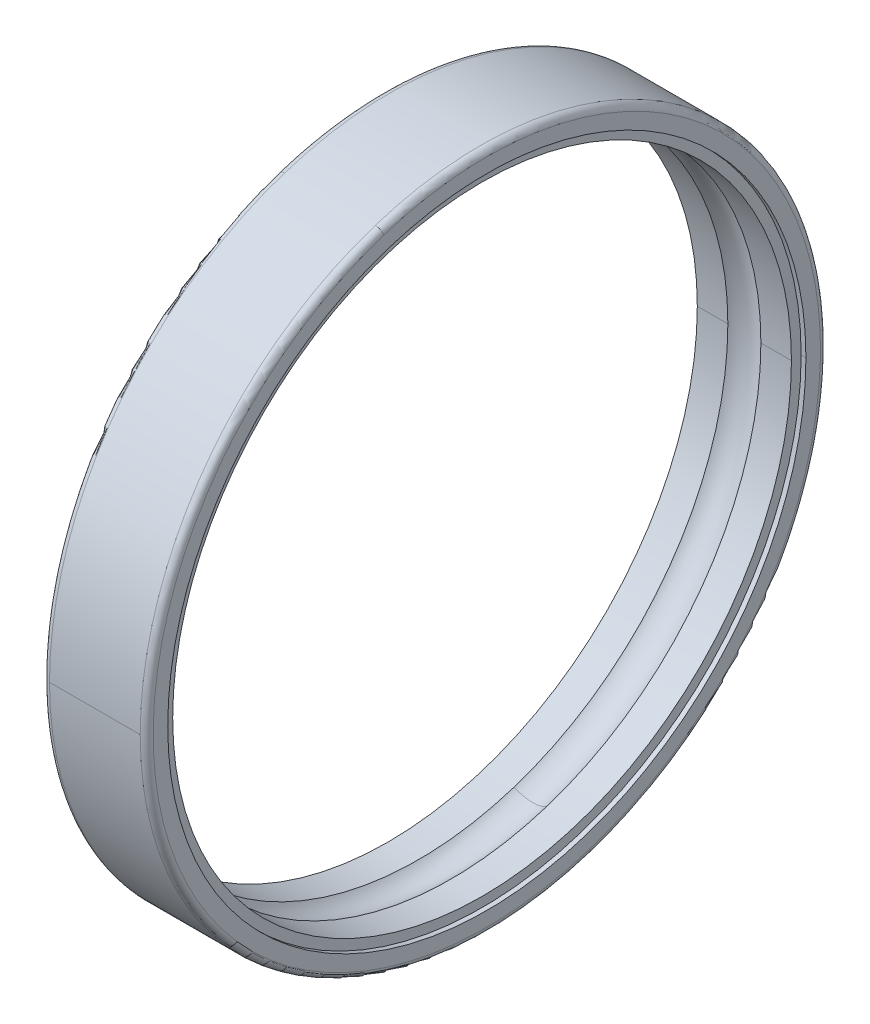
ISO-10303-21;
HEADER;
FILE_DESCRIPTION(('STEP AP214'),'2;1');
FILE_NAME('part.step','',(''),(''),'','','');
FILE_SCHEMA(('AUTOMOTIVE_DESIGN { 1 0 10303 214 1 1 1 1 }'));
ENDSEC;
DATA;
#1=APPLICATION_CONTEXT('core data for automotive mechanical design processes');
#2=APPLICATION_PROTOCOL_DEFINITION('international standard','automotive_design',2000,#1);
#3=PRODUCT_CONTEXT('',#1,'mechanical');
#4=PRODUCT('Part','Part','',(#3));
#5=PRODUCT_RELATED_PRODUCT_CATEGORY('part','',(#4));
#6=PRODUCT_DEFINITION_FORMATION('','',#4);
#7=PRODUCT_DEFINITION_CONTEXT('part definition',#1,'design');
#8=PRODUCT_DEFINITION('design','',#6,#7);
#9=PRODUCT_DEFINITION_SHAPE('','',#8);
#10=(LENGTH_UNIT() NAMED_UNIT(*) SI_UNIT(.MILLI.,.METRE.));
#11=(NAMED_UNIT(*) PLANE_ANGLE_UNIT() SI_UNIT($,.RADIAN.));
#12=(NAMED_UNIT(*) SI_UNIT($,.STERADIAN.) SOLID_ANGLE_UNIT());
#13=UNCERTAINTY_MEASURE_WITH_UNIT(LENGTH_MEASURE(1.E-05),#10,'distance_accuracy_value','');
#14=(GEOMETRIC_REPRESENTATION_CONTEXT(3) GLOBAL_UNCERTAINTY_ASSIGNED_CONTEXT((#13)) GLOBAL_UNIT_ASSIGNED_CONTEXT((#10,
#11,#12)) REPRESENTATION_CONTEXT('',''));
#15=CARTESIAN_POINT('',(0.,0.,0.));
#16=DIRECTION('',(0.,0.,1.));
#17=DIRECTION('',(1.,0.,0.));
#18=AXIS2_PLACEMENT_3D('',#15,#16,#17);
#19=CARTESIAN_POINT('',(0.,51.5,0.));
#20=DIRECTION('',(-1.,0.,0.));
#21=DIRECTION('',(0.,0.,1.));
#22=AXIS2_PLACEMENT_3D('',#19,#20,#21);
#23=PLANE('',#22);
#24=CARTESIAN_POINT('',(0.,0.,0.));
#25=DIRECTION('',(1.,0.,0.));
#26=DIRECTION('',(0.,0.,-1.));
#27=AXIS2_PLACEMENT_3D('',#24,#25,#26);
#28=CIRCLE('',#27,49.25);
#29=CARTESIAN_POINT('',(0.,0.,-49.25));
#30=VERTEX_POINT('',#29);
#31=CARTESIAN_POINT('',(0.,0.,49.25));
#32=VERTEX_POINT('',#31);
#33=EDGE_CURVE('E11',#30,#32,#28,.T.);
#34=ORIENTED_EDGE('',*,*,#33,.T.);
#35=CARTESIAN_POINT('',(0.,0.,0.));
#36=DIRECTION('',(1.,0.,0.));
#37=DIRECTION('',(0.,0.,-1.));
#38=AXIS2_PLACEMENT_3D('',#35,#36,#37);
#39=CIRCLE('',#38,49.25);
#40=EDGE_CURVE('E28',#32,#30,#39,.T.);
#41=ORIENTED_EDGE('',*,*,#40,.T.);
#42=EDGE_LOOP('',(#34,#41));
#43=FACE_BOUND('',#42,.T.);
#44=CARTESIAN_POINT('',(0.,48.9794105892011,15.9143752103102));
#45=CARTESIAN_POINT('',(0.,48.7190289709904,16.7158052750082));
#46=CARTESIAN_POINT('',(0.,48.4389445298725,17.5108319052051));
#47=CARTESIAN_POINT('',(0.,47.840118198443,19.0861909266786));
#48=CARTESIAN_POINT('',(0.,47.5213763081314,19.8665233179551));
#49=CARTESIAN_POINT('',(0.,46.845983274935,21.4106064916693));
#50=CARTESIAN_POINT('',(0.,46.4893321320502,22.1743572741071));
#51=CARTESIAN_POINT('',(0.,45.7389850709269,23.6834392920971));
#52=CARTESIAN_POINT('',(0.,45.3452891526884,24.4287705276492));
#53=CARTESIAN_POINT('',(0.,44.521799575811,25.8992173465381));
#54=CARTESIAN_POINT('',(0.,44.0920059171723,26.6243329298749));
#55=CARTESIAN_POINT('',(0.,43.1973566486751,28.0526017212956));
#56=CARTESIAN_POINT('',(0.,42.7325010388167,28.7557549293796));
#57=CARTESIAN_POINT('',(0.,41.7688476443124,30.1384049740656));
#58=CARTESIAN_POINT('',(0.,41.2700498596664,30.8179018106675));
#59=CARTESIAN_POINT('',(0.,40.2397137903227,32.1516021553258));
#60=CARTESIAN_POINT('',(0.,39.708175505625,32.8058056633821));
#61=CARTESIAN_POINT('',(0.,38.6136389511792,34.0873433146281));
#62=CARTESIAN_POINT('',(0.,38.0506406814312,34.7146774578178));
#63=CARTESIAN_POINT('',(0.,36.894540470981,35.9409650771734));
#64=CARTESIAN_POINT('',(0.,36.3014385302789,36.5399185533394));
#65=CARTESIAN_POINT('',(0.,35.0865598119225,37.7080019070626));
#66=CARTESIAN_POINT('',(0.,34.4647830342682,38.2771317846199));
#67=CARTESIAN_POINT('',(0.,33.194052556866,39.3841968574541));
#68=CARTESIAN_POINT('',(0.,32.5450988571181,39.922132052731));
#69=CARTESIAN_POINT('',(0.,31.2215779217956,40.9655118279872));
#70=CARTESIAN_POINT('',(0.,30.547010686221,41.4709564079665));
#71=CARTESIAN_POINT('',(0.,29.1738877708107,42.4481372923664));
#72=CARTESIAN_POINT('',(0.,28.475332090975,42.919873596787));
#73=CARTESIAN_POINT('',(0.,27.0559151688587,43.828501475992));
#74=CARTESIAN_POINT('',(0.,26.3350539265782,44.2653930507763));
#75=CARTESIAN_POINT('',(0.,24.8727624974458,45.1032789606382));
#76=CARTESIAN_POINT('',(0.,24.1313323105938,45.5042732957157));
#77=CARTESIAN_POINT('',(0.,22.62968916258,46.2693986956877));
#78=CARTESIAN_POINT('',(0.,21.8694762014182,46.6335297605821));
#79=CARTESIAN_POINT('',(0.,20.3320989243949,47.3240513965586));
#80=CARTESIAN_POINT('',(0.,19.5549346085334,47.6504419676405));
#81=CARTESIAN_POINT('',(0.,17.9855268790194,48.2646963125178));
#82=CARTESIAN_POINT('',(0.,17.1932834653668,48.5525600863131));
#83=CARTESIAN_POINT('',(0.,15.5956261240462,49.0890673475721));
#84=CARTESIAN_POINT('',(0.,14.7902121963782,49.3377108350357));
#85=CARTESIAN_POINT('',(0.,13.1681541397247,49.7951785196915));
#86=CARTESIAN_POINT('',(0.,12.3515100107391,50.0040027168837));
#87=CARTESIAN_POINT('',(0.,10.7089589186865,50.3813287452146));
#88=CARTESIAN_POINT('',(0.,9.88305195561949,50.5498305763533));
#89=CARTESIAN_POINT('',(0.,8.22396487761912,50.8461059369072));
#90=CARTESIAN_POINT('',(0.,7.39078476268573,50.9738794663223));
#91=CARTESIAN_POINT('',(0.,5.71915858482735,51.1883904058048));
#92=CARTESIAN_POINT('',(0.,4.88071252190237,51.2751278158723));
#93=CARTESIAN_POINT('',(0.,3.20057433806561,51.4073575586415));
#94=CARTESIAN_POINT('',(0.,2.35888221715382,51.4528498913432));
#95=CARTESIAN_POINT('',(0.,0.674279627386248,51.5024798843666));
#96=CARTESIAN_POINT('',(0.,-0.168630841469536,51.5066175446884));
#97=CARTESIAN_POINT('',(0.,-1.85363948197539,51.4735282249659));
#98=CARTESIAN_POINT('',(0.,-2.69573765362546,51.4363012449216));
#99=CARTESIAN_POINT('',(0.,-4.37709301146531,51.3205723275226));
#100=CARTESIAN_POINT('',(0.,-5.21635019765509,51.2420703901679));
#101=CARTESIAN_POINT('',(0.,-6.89000174050256,51.0439806761911));
#102=CARTESIAN_POINT('',(0.,-7.72439609716024,50.924392899569));
#103=CARTESIAN_POINT('',(0.,-9.38631185185404,50.644419604486));
#104=CARTESIAN_POINT('',(0.,-10.2138332498902,50.484034086025));
#105=CARTESIAN_POINT('',(0.,-11.8600095158106,50.1228516900264));
#106=CARTESIAN_POINT('',(0.,-12.6786643836949,49.9220548124887));
#107=CARTESIAN_POINT('',(0.,-14.3051353780294,49.4805334356022));
#108=CARTESIAN_POINT('',(0.,-15.1129515044796,49.2398089362535));
#109=CARTESIAN_POINT('',(0.,-16.7157989161407,48.7190122421488));
#110=CARTESIAN_POINT('',(0.,-17.5108302013517,48.4389400473929));
#111=CARTESIAN_POINT('',(0.,-19.0861926305319,47.8401226809226));
#112=CARTESIAN_POINT('',(0.,-19.8665237745012,47.5213775092082));
#113=CARTESIAN_POINT('',(0.,-21.4106060351231,46.8459820738582));
#114=CARTESIAN_POINT('',(0.,-22.1743571517759,46.4893318102227));
#115=CARTESIAN_POINT('',(0.,-23.6834394144282,45.7389853927545));
#116=CARTESIAN_POINT('',(0.,-24.4287705604277,45.3452892389218));
#117=CARTESIAN_POINT('',(0.,-25.8992173137596,44.5217994895776));
#118=CARTESIAN_POINT('',(0.,-26.6243329210919,44.0920058940661));
#119=CARTESIAN_POINT('',(0.,-28.0526017300786,43.1973566717813));
#120=CARTESIAN_POINT('',(0.,-28.755754931733,42.732501045008));
#121=CARTESIAN_POINT('',(0.,-30.1384049717121,41.7688476381211));
#122=CARTESIAN_POINT('',(0.,-30.8179018100369,41.2700498580075));
#123=CARTESIAN_POINT('',(0.,-32.1516021559563,40.2397137919817));
#124=CARTESIAN_POINT('',(0.,-32.805805663551,39.7081755060696));
#125=CARTESIAN_POINT('',(0.,-34.0873433144591,38.6136389507348));
#126=CARTESIAN_POINT('',(0.,-34.7146774577724,38.0506406813121));
#127=CARTESIAN_POINT('',(0.,-35.9409650772186,36.8945404711002));
#128=CARTESIAN_POINT('',(0.,-36.5399185533515,36.3014385303109));
#129=CARTESIAN_POINT('',(0.,-37.7080019070504,35.0865598118906));
#130=CARTESIAN_POINT('',(0.,-38.2771317846166,34.4647830342596));
#131=CARTESIAN_POINT('',(0.,-39.3841968574573,33.1940525568745));
#132=CARTESIAN_POINT('',(0.,-39.9221320527318,32.5450988571204));
#133=CARTESIAN_POINT('',(0.,-40.9655118279863,31.2215779217934));
#134=CARTESIAN_POINT('',(0.,-41.4709564079662,30.5470106862204));
#135=CARTESIAN_POINT('',(0.,-42.4481372923666,29.1738877708113));
#136=CARTESIAN_POINT('',(0.,-42.919873596787,28.4753320909752));
#137=CARTESIAN_POINT('',(0.,-43.8285014759919,27.0559151688586));
#138=CARTESIAN_POINT('',(0.,-44.2653930507763,26.3350539265782));
#139=CARTESIAN_POINT('',(0.,-45.1032789606382,24.8727624974459));
#140=CARTESIAN_POINT('',(0.,-45.5042732957157,24.1313323105939));
#141=CARTESIAN_POINT('',(0.,-46.2693986956877,22.6296891625801));
#142=CARTESIAN_POINT('',(0.,-46.6335297605821,21.8694762014182));
#143=CARTESIAN_POINT('',(0.,-47.3240513965586,20.3320989243949));
#144=CARTESIAN_POINT('',(0.,-47.6504419676407,19.5549346085334));
#145=CARTESIAN_POINT('',(0.,-48.2646963125176,17.9855268790195));
#146=CARTESIAN_POINT('',(0.,-48.5525600863125,17.193283465367));
#147=CARTESIAN_POINT('',(0.,-49.0890673475727,15.5956261240461));
#148=CARTESIAN_POINT('',(0.,-49.3377108350381,14.7902121963776));
#149=CARTESIAN_POINT('',(0.,-49.7951785196892,13.1681541397254));
#150=CARTESIAN_POINT('',(0.,-50.0040027168748,12.3515100107415));
#151=CARTESIAN_POINT('',(0.,-50.3813287452234,10.7089589186841));
#152=CARTESIAN_POINT('',(0.,-50.5498305763862,9.88305195561061));
#153=CARTESIAN_POINT('',(0.,-50.8461059368742,8.22396487762812));
#154=CARTESIAN_POINT('',(0.,-50.9738794661993,7.39078476271915));
#155=CARTESIAN_POINT('',(0.,-51.1883904059278,5.719158584794));
#156=CARTESIAN_POINT('',(0.,-51.2751278163312,4.88071252177782));
#157=CARTESIAN_POINT('',(0.,-51.4073575581825,3.20057433819022));
#158=CARTESIAN_POINT('',(0.,-51.4528498896304,2.35888221761881));
#159=CARTESIAN_POINT('',(0.,-51.5024798860794,0.674279626921349));
#160=CARTESIAN_POINT('',(0.,-51.5066175510805,-0.168630843204695));
#161=CARTESIAN_POINT('',(0.,-51.4735282185737,-1.85363948024013));
#162=CARTESIAN_POINT('',(0.,-51.4363012210658,-2.69573764714952));
#163=CARTESIAN_POINT('',(0.,-51.3205723513784,-4.37709301794116));
#164=CARTESIAN_POINT('',(0.,-51.242070479199,-5.2163502218234));
#165=CARTESIAN_POINT('',(0.,-51.04398058716,-6.89000171633418));
#166=CARTESIAN_POINT('',(0.,-50.9243925673006,-7.72439600696272));
#167=CARTESIAN_POINT('',(0.,-50.6444199367544,-9.38631194205151));
#168=CARTESIAN_POINT('',(0.,-50.4840353260676,-10.2138335865118));
#169=CARTESIAN_POINT('',(0.,-50.1228504499838,-11.8600091791889));
#170=CARTESIAN_POINT('',(0.,-49.9220501845866,-12.6786631274058));
#171=CARTESIAN_POINT('',(0.,-49.4805380635043,-14.3051366343184));
#172=CARTESIAN_POINT('',(0.,-49.2398262078191,-15.1129561930141));
#173=CARTESIAN_POINT('',(0.,-48.9794105892012,-15.9143752103101));
#174=B_SPLINE_CURVE_WITH_KNOTS('',3,(#44,#45,#46,#47,#48,#49,#50,#51,#52,#53,#54,#55,#56,#57,
#58,#59,#60,#61,#62,#63,#64,#65,#66,#67,#68,#69,#70,#71,#72,#73,#74,#75,#76,#77,#78,#79,#80,#81,
#82,#83,#84,#85,#86,#87,#88,#89,#90,#91,#92,#93,#94,#95,#96,#97,#98,#99,#100,#101,#102,#103,
#104,#105,#106,#107,#108,#109,#110,#111,#112,#113,#114,#115,#116,#117,#118,#119,#120,#121,#122,
#123,#124,#125,#126,#127,#128,#129,#130,#131,#132,#133,#134,#135,#136,#137,#138,#139,#140,#141,
#142,#143,#144,#145,#146,#147,#148,#149,#150,#151,#152,#153,#154,#155,#156,#157,#158,#159,#160,
#161,#162,#163,#164,#165,#166,#167,#168,#169,#170,#171,#172,#173),.UNSPECIFIED.,.F.,.F.,(4,2,2,
2,2,2,2,2,2,2,2,2,2,2,2,2,2,2,2,2,2,2,2,2,2,2,2,2,2,2,2,2,2,2,2,2,2,2,2,2,2,2,2,2,2,2,2,2,2,2,2,
2,2,2,2,2,2,2,2,2,2,2,2,2,4),(0.,2.52774653785999,5.05549307572001,7.58323961358001,
10.11098615144,12.6387326893,15.16647922716,17.69422576502,20.22197230288,22.74971884074,
25.2774653786,27.8052119164601,30.33295845432,32.8607049921801,35.3884515300401,
37.9161980679001,40.4439446057601,42.9716911436201,45.4994376814801,48.0271842193401,
50.5549307572001,53.0826772950601,55.6104238329201,58.1381703707801,60.6659169086401,
63.1936634465001,65.7214099843601,68.2491565222201,70.7769030600801,73.3046495979401,
75.8323961358001,78.3601426736601,80.8878892115201,83.4156357493802,85.9433822872401,
88.4711288251002,90.9988753629601,93.5266219008202,96.0543684386801,98.5821149765401,
101.1098615144,103.63760805226,106.16535459012,108.69310112798,111.22084766584,113.7485942037,
116.27634074156,118.80408727942,121.33183381728,123.85958035514,126.387326893,128.91507343086,
131.44281996872,133.97056650658,136.49831304444,139.0260595823,141.55380612016,144.08155265802,
146.60929919588,149.13704573374,151.6647922716,154.19253880946,156.72028534732,159.24803188518,
161.77577842304),.UNSPECIFIED.);
#175=CARTESIAN_POINT('',(0.,48.9794105892012,15.91437521031));
#176=VERTEX_POINT('',#175);
#177=CARTESIAN_POINT('',(0.,-48.9794105892012,-15.91437521031));
#178=VERTEX_POINT('',#177);
#179=EDGE_CURVE('E320',#176,#178,#174,.T.);
#180=ORIENTED_EDGE('',*,*,#179,.F.);
#181=CARTESIAN_POINT('',(0.,-48.9794105892011,-15.9143752103102));
#182=CARTESIAN_POINT('',(0.,-48.7190289709904,-16.7158052750082));
#183=CARTESIAN_POINT('',(0.,-48.4389445298725,-17.5108319052051));
#184=CARTESIAN_POINT('',(0.,-47.840118198443,-19.0861909266786));
#185=CARTESIAN_POINT('',(0.,-47.5213763081314,-19.8665233179551));
#186=CARTESIAN_POINT('',(0.,-46.845983274935,-21.4106064916693));
#187=CARTESIAN_POINT('',(0.,-46.4893321320502,-22.1743572741071));
#188=CARTESIAN_POINT('',(0.,-45.7389850709269,-23.683439292097));
#189=CARTESIAN_POINT('',(0.,-45.3452891526884,-24.4287705276492));
#190=CARTESIAN_POINT('',(0.,-44.521799575811,-25.8992173465381));
#191=CARTESIAN_POINT('',(0.,-44.0920059171723,-26.6243329298749));
#192=CARTESIAN_POINT('',(0.,-43.1973566486751,-28.0526017212956));
#193=CARTESIAN_POINT('',(0.,-42.7325010388167,-28.7557549293796));
#194=CARTESIAN_POINT('',(0.,-41.7688476443124,-30.1384049740655));
#195=CARTESIAN_POINT('',(0.,-41.2700498596664,-30.8179018106675));
#196=CARTESIAN_POINT('',(0.,-40.2397137903227,-32.1516021553257));
#197=CARTESIAN_POINT('',(0.,-39.708175505625,-32.8058056633821));
#198=CARTESIAN_POINT('',(0.,-38.6136389511793,-34.0873433146281));
#199=CARTESIAN_POINT('',(0.,-38.0506406814312,-34.7146774578177));
#200=CARTESIAN_POINT('',(0.,-36.894540470981,-35.9409650771734));
#201=CARTESIAN_POINT('',(0.,-36.301438530279,-36.5399185533393));
#202=CARTESIAN_POINT('',(0.,-35.0865598119225,-37.7080019070626));
#203=CARTESIAN_POINT('',(0.,-34.4647830342682,-38.2771317846198));
#204=CARTESIAN_POINT('',(0.,-33.194052556866,-39.384196857454));
#205=CARTESIAN_POINT('',(0.,-32.5450988571181,-39.9221320527309));
#206=CARTESIAN_POINT('',(0.,-31.2215779217956,-40.9655118279871));
#207=CARTESIAN_POINT('',(0.,-30.547010686221,-41.4709564079664));
#208=CARTESIAN_POINT('',(0.,-29.1738877708107,-42.4481372923664));
#209=CARTESIAN_POINT('',(0.,-28.475332090975,-42.919873596787));
#210=CARTESIAN_POINT('',(0.,-27.0559151688588,-43.828501475992));
#211=CARTESIAN_POINT('',(0.,-26.3350539265783,-44.2653930507763));
#212=CARTESIAN_POINT('',(0.,-24.8727624974458,-45.1032789606382));
#213=CARTESIAN_POINT('',(0.,-24.1313323105939,-45.5042732957157));
#214=CARTESIAN_POINT('',(0.,-22.6296891625801,-46.2693986956877));
#215=CARTESIAN_POINT('',(0.,-21.8694762014182,-46.6335297605821));
#216=CARTESIAN_POINT('',(0.,-20.3320989243949,-47.3240513965586));
#217=CARTESIAN_POINT('',(0.,-19.5549346085335,-47.6504419676405));
#218=CARTESIAN_POINT('',(0.,-17.9855268790194,-48.2646963125178));
#219=CARTESIAN_POINT('',(0.,-17.1932834653668,-48.5525600863131));
#220=CARTESIAN_POINT('',(0.,-15.5956261240462,-49.089067347572));
#221=CARTESIAN_POINT('',(0.,-14.7902121963783,-49.3377108350357));
#222=CARTESIAN_POINT('',(0.,-13.1681541397247,-49.7951785196915));
#223=CARTESIAN_POINT('',(0.,-12.3515100107391,-50.0040027168837));
#224=CARTESIAN_POINT('',(0.,-10.7089589186865,-50.3813287452145));
#225=CARTESIAN_POINT('',(0.,-9.88305195561955,-50.5498305763533));
#226=CARTESIAN_POINT('',(0.,-8.22396487761919,-50.8461059369071));
#227=CARTESIAN_POINT('',(0.,-7.3907847626858,-50.9738794663222));
#228=CARTESIAN_POINT('',(0.,-5.71915858482743,-51.1883904058048));
#229=CARTESIAN_POINT('',(0.,-4.88071252190245,-51.2751278158723));
#230=CARTESIAN_POINT('',(0.,-3.20057433806567,-51.4073575586415));
#231=CARTESIAN_POINT('',(0.,-2.35888221715388,-51.4528498913432));
#232=CARTESIAN_POINT('',(0.,-0.674279627386307,-51.5024798843666));
#233=CARTESIAN_POINT('',(0.,0.168630841469469,-51.5066175446884));
#234=CARTESIAN_POINT('',(0.,1.85363948197532,-51.4735282249659));
#235=CARTESIAN_POINT('',(0.,2.69573765362539,-51.4363012449216));
#236=CARTESIAN_POINT('',(0.,4.37709301146523,-51.3205723275226));
#237=CARTESIAN_POINT('',(0.,5.216350197655,-51.2420703901679));
#238=CARTESIAN_POINT('',(0.,6.89000174050246,-51.0439806761911));
#239=CARTESIAN_POINT('',(0.,7.72439609716015,-50.924392899569));
#240=CARTESIAN_POINT('',(0.,9.38631185185395,-50.644419604486));
#241=CARTESIAN_POINT('',(0.,10.2138332498901,-50.484034086025));
#242=CARTESIAN_POINT('',(0.,11.8600095158105,-50.1228516900264));
#243=CARTESIAN_POINT('',(0.,12.6786643836948,-49.9220548124887));
#244=CARTESIAN_POINT('',(0.,14.3051353780293,-49.4805334356022));
#245=CARTESIAN_POINT('',(0.,15.1129515044795,-49.2398089362535));
#246=CARTESIAN_POINT('',(0.,16.7157989161406,-48.7190122421489));
#247=CARTESIAN_POINT('',(0.,17.5108302013516,-48.438940047393));
#248=CARTESIAN_POINT('',(0.,19.0861926305318,-47.8401226809227));
#249=CARTESIAN_POINT('',(0.,19.8665237745011,-47.5213775092082));
#250=CARTESIAN_POINT('',(0.,21.4106060351231,-46.8459820738583));
#251=CARTESIAN_POINT('',(0.,22.1743571517758,-46.4893318102227));
#252=CARTESIAN_POINT('',(0.,23.6834394144281,-45.7389853927545));
#253=CARTESIAN_POINT('',(0.,24.4287705604276,-45.3452892389219));
#254=CARTESIAN_POINT('',(0.,25.8992173137595,-44.5217994895777));
#255=CARTESIAN_POINT('',(0.,26.6243329210918,-44.0920058940662));
#256=CARTESIAN_POINT('',(0.,28.0526017300785,-43.1973566717814));
#257=CARTESIAN_POINT('',(0.,28.7557549317329,-42.7325010450081));
#258=CARTESIAN_POINT('',(0.,30.138404971712,-41.7688476381212));
#259=CARTESIAN_POINT('',(0.,30.8179018100368,-41.2700498580076));
#260=CARTESIAN_POINT('',(0.,32.1516021559562,-40.2397137919818));
#261=CARTESIAN_POINT('',(0.,32.8058056635509,-39.7081755060696));
#262=CARTESIAN_POINT('',(0.,34.087343314459,-38.6136389507348));
#263=CARTESIAN_POINT('',(0.,34.7146774577723,-38.0506406813122));
#264=CARTESIAN_POINT('',(0.,35.9409650772185,-36.8945404711003));
#265=CARTESIAN_POINT('',(0.,36.5399185533514,-36.301438530311));
#266=CARTESIAN_POINT('',(0.,37.7080019070504,-35.0865598118907));
#267=CARTESIAN_POINT('',(0.,38.2771317846165,-34.4647830342598));
#268=CARTESIAN_POINT('',(0.,39.3841968574572,-33.1940525568747));
#269=CARTESIAN_POINT('',(0.,39.9221320527317,-32.5450988571205));
#270=CARTESIAN_POINT('',(0.,40.9655118279862,-31.2215779217935));
#271=CARTESIAN_POINT('',(0.,41.4709564079661,-30.5470106862205));
#272=CARTESIAN_POINT('',(0.,42.4481372923665,-29.1738877708114));
#273=CARTESIAN_POINT('',(0.,42.919873596787,-28.4753320909753));
#274=CARTESIAN_POINT('',(0.,43.8285014759918,-27.0559151688588));
#275=CARTESIAN_POINT('',(0.,44.2653930507762,-26.3350539265784));
#276=CARTESIAN_POINT('',(0.,45.1032789606381,-24.872762497446));
#277=CARTESIAN_POINT('',(0.,45.5042732957156,-24.131332310594));
#278=CARTESIAN_POINT('',(0.,46.2693986956876,-22.6296891625802));
#279=CARTESIAN_POINT('',(0.,46.633529760582,-21.8694762014184));
#280=CARTESIAN_POINT('',(0.,47.3240513965586,-20.332098924395));
#281=CARTESIAN_POINT('',(0.,47.6504419676406,-19.5549346085336));
#282=CARTESIAN_POINT('',(0.,48.2646963125176,-17.9855268790196));
#283=CARTESIAN_POINT('',(0.,48.5525600863124,-17.1932834653671));
#284=CARTESIAN_POINT('',(0.,49.0890673475726,-15.5956261240462));
#285=CARTESIAN_POINT('',(0.,49.337710835038,-14.7902121963778));
#286=CARTESIAN_POINT('',(0.,49.7951785196891,-13.1681541397255));
#287=CARTESIAN_POINT('',(0.,50.0040027168748,-12.3515100107416));
#288=CARTESIAN_POINT('',(0.,50.3813287452233,-10.7089589186843));
#289=CARTESIAN_POINT('',(0.,50.5498305763862,-9.88305195561075));
#290=CARTESIAN_POINT('',(0.,50.8461059368742,-8.22396487762828));
#291=CARTESIAN_POINT('',(0.,50.9738794661993,-7.39078476271932));
#292=CARTESIAN_POINT('',(0.,51.1883904059278,-5.71915858479419));
#293=CARTESIAN_POINT('',(0.,51.2751278163312,-4.88071252177801));
#294=CARTESIAN_POINT('',(0.,51.4073575581825,-3.20057433819041));
#295=CARTESIAN_POINT('',(0.,51.4528498896304,-2.358882217619));
#296=CARTESIAN_POINT('',(0.,51.5024798860794,-0.674279626921537));
#297=CARTESIAN_POINT('',(0.,51.5066175510805,0.168630843204504));
#298=CARTESIAN_POINT('',(0.,51.4735282185738,1.85363948023994));
#299=CARTESIAN_POINT('',(0.,51.4363012210658,2.69573764714934));
#300=CARTESIAN_POINT('',(0.,51.3205723513784,4.37709301794097));
#301=CARTESIAN_POINT('',(0.,51.242070479199,5.21635022182321));
#302=CARTESIAN_POINT('',(0.,51.0439805871601,6.890001716334));
#303=CARTESIAN_POINT('',(0.,50.9243925673006,7.72439600696254));
#304=CARTESIAN_POINT('',(0.,50.6444199367544,9.38631194205132));
#305=CARTESIAN_POINT('',(0.,50.4840353260677,10.2138335865116));
#306=CARTESIAN_POINT('',(0.,50.1228504499838,11.8600091791887));
#307=CARTESIAN_POINT('',(0.,49.9220501845867,12.6786631274057));
#308=CARTESIAN_POINT('',(0.,49.4805380635043,14.3051366343182));
#309=CARTESIAN_POINT('',(0.,49.2398262078192,15.1129561930139));
#310=CARTESIAN_POINT('',(0.,48.9794105892012,15.9143752103099));
#311=B_SPLINE_CURVE_WITH_KNOTS('',3,(#181,#182,#183,#184,#185,#186,#187,#188,#189,#190,#191,
#192,#193,#194,#195,#196,#197,#198,#199,#200,#201,#202,#203,#204,#205,#206,#207,#208,#209,#210,
#211,#212,#213,#214,#215,#216,#217,#218,#219,#220,#221,#222,#223,#224,#225,#226,#227,#228,#229,
#230,#231,#232,#233,#234,#235,#236,#237,#238,#239,#240,#241,#242,#243,#244,#245,#246,#247,#248,
#249,#250,#251,#252,#253,#254,#255,#256,#257,#258,#259,#260,#261,#262,#263,#264,#265,#266,#267,
#268,#269,#270,#271,#272,#273,#274,#275,#276,#277,#278,#279,#280,#281,#282,#283,#284,#285,#286,
#287,#288,#289,#290,#291,#292,#293,#294,#295,#296,#297,#298,#299,#300,#301,#302,#303,#304,#305,
#306,#307,#308,#309,#310),.UNSPECIFIED.,.F.,.F.,(4,2,2,2,2,2,2,2,2,2,2,2,2,2,2,2,2,2,2,2,2,2,2,
2,2,2,2,2,2,2,2,2,2,2,2,2,2,2,2,2,2,2,2,2,2,2,2,2,2,2,2,2,2,2,2,2,2,2,2,2,2,2,2,2,4),(0.,
2.52774653785999,5.05549307572,7.58323961357999,10.11098615144,12.6387326893,15.16647922716,
17.69422576502,20.22197230288,22.74971884074,25.2774653786,27.80521191646,30.33295845432,
32.86070499218,35.38845153004,37.9161980679,40.44394460576,42.97169114362,45.49943768148,
48.02718421934,50.5549307572,53.08267729506,55.61042383292,58.13817037078,60.66591690864,
63.1936634465,65.72140998436,68.24915652222,70.77690306008,73.30464959794,75.8323961358,
78.36014267366,80.88788921152,83.41563574938,85.94338228724,88.4711288251,90.99887536296,
93.52662190082,96.05436843868,98.58211497654,101.1098615144,103.63760805226,106.16535459012,
108.69310112798,111.22084766584,113.7485942037,116.27634074156,118.80408727942,121.33183381728,
123.85958035514,126.387326893,128.91507343086,131.44281996872,133.97056650658,136.49831304444,
139.0260595823,141.55380612016,144.08155265802,146.60929919588,149.13704573374,151.6647922716,
154.19253880946,156.72028534732,159.24803188518,161.77577842304),.UNSPECIFIED.);
#312=EDGE_CURVE('E422',#178,#176,#311,.T.);
#313=ORIENTED_EDGE('',*,*,#312,.F.);
#314=EDGE_LOOP('',(#180,#313));
#315=FACE_BOUND('',#314,.T.);
#316=ADVANCED_FACE('F19',(#43,#315),#23,.T.);
#317=CARTESIAN_POINT('',(0.99999999999922,0.,0.));
#318=DIRECTION('',(1.,0.,0.));
#319=DIRECTION('',(0.,-0.309016994374947,0.951056516295154));
#320=AXIS2_PLACEMENT_3D('',#317,#318,#319);
#321=TOROIDAL_SURFACE('',#320,51.5000000000008,0.999999999999224);
#322=CARTESIAN_POINT('',(0.99999999999922,-48.9794105892012,-15.91437521031));
#323=DIRECTION('',(0.,0.309016994374943,-0.951056516295155));
#324=DIRECTION('',(7.80153719404699E-13,-0.951056516295155,-0.309016994374943));
#325=AXIS2_PLACEMENT_3D('',#322,#323,#324);
#326=CIRCLE('',#325,0.999999999999229);
#327=CARTESIAN_POINT('',(1.,-49.9304671054956,-16.2233922046847));
#328=VERTEX_POINT('',#327);
#329=EDGE_CURVE('E385',#328,#178,#326,.T.);
#330=ORIENTED_EDGE('',*,*,#329,.T.);
#331=ORIENTED_EDGE('',*,*,#312,.T.);
#332=CARTESIAN_POINT('',(0.99999999999922,48.9794105892012,15.91437521031));
#333=DIRECTION('',(0.,-0.309016994374945,0.951056516295155));
#334=DIRECTION('',(7.80153719404699E-13,0.951056516295155,0.309016994374945));
#335=AXIS2_PLACEMENT_3D('',#332,#333,#334);
#336=CIRCLE('',#335,0.99999999999923);
#337=CARTESIAN_POINT('',(1.,49.9304671054956,16.2233922046847));
#338=VERTEX_POINT('',#337);
#339=EDGE_CURVE('E381',#338,#176,#336,.T.);
#340=ORIENTED_EDGE('',*,*,#339,.F.);
#341=CARTESIAN_POINT('',(1.,0.,0.));
#342=DIRECTION('',(1.,0.,0.));
#343=DIRECTION('',(0.,0.,-1.));
#344=AXIS2_PLACEMENT_3D('',#341,#342,#343);
#345=CIRCLE('',#344,52.5);
#346=CARTESIAN_POINT('',(1.,0.,-52.5));
#347=VERTEX_POINT('',#346);
#348=EDGE_CURVE('E376',#347,#338,#345,.T.);
#349=ORIENTED_EDGE('',*,*,#348,.F.);
#350=CARTESIAN_POINT('',(1.,0.,0.));
#351=DIRECTION('',(1.,0.,0.));
#352=DIRECTION('',(0.,0.,-1.));
#353=AXIS2_PLACEMENT_3D('',#350,#351,#352);
#354=CIRCLE('',#353,52.5);
#355=EDGE_CURVE('E371',#328,#347,#354,.T.);
#356=ORIENTED_EDGE('',*,*,#355,.F.);
#357=EDGE_LOOP('',(#330,#331,#340,#349,#356));
#358=FACE_BOUND('',#357,.T.);
#359=ADVANCED_FACE('F393',(#358),#321,.T.);
#360=CARTESIAN_POINT('',(16.,0.,0.));
#361=DIRECTION('',(1.,0.,0.));
#362=DIRECTION('',(0.,1.,0.));
#363=AXIS2_PLACEMENT_3D('',#360,#361,#362);
#364=CYLINDRICAL_SURFACE('',#363,52.5);
#365=DIRECTION('',(1.,0.,0.));
#366=VECTOR('',#365,1.);
#367=CARTESIAN_POINT('',(1.,0.,52.5));
#368=LINE('',#367,#366);
#369=CARTESIAN_POINT('',(1.,0.,52.5));
#370=VERTEX_POINT('',#369);
#371=CARTESIAN_POINT('',(15.,0.,52.5));
#372=VERTEX_POINT('',#371);
#373=EDGE_CURVE('E366',#370,#372,#368,.T.);
#374=ORIENTED_EDGE('',*,*,#373,.F.);
#375=CARTESIAN_POINT('',(1.,0.,0.));
#376=DIRECTION('',(1.,0.,0.));
#377=DIRECTION('',(0.,0.,-1.));
#378=AXIS2_PLACEMENT_3D('',#375,#376,#377);
#379=CIRCLE('',#378,52.5);
#380=EDGE_CURVE('E361',#370,#328,#379,.T.);
#381=ORIENTED_EDGE('',*,*,#380,.T.);
#382=ORIENTED_EDGE('',*,*,#355,.T.);
#383=DIRECTION('',(1.,0.,0.));
#384=VECTOR('',#383,1.);
#385=CARTESIAN_POINT('',(1.,0.,-52.5));
#386=LINE('',#385,#384);
#387=CARTESIAN_POINT('',(15.,0.,-52.5));
#388=VERTEX_POINT('',#387);
#389=EDGE_CURVE('E357',#347,#388,#386,.T.);
#390=ORIENTED_EDGE('',*,*,#389,.T.);
#391=CARTESIAN_POINT('',(15.,0.,0.));
#392=DIRECTION('',(1.,0.,0.));
#393=DIRECTION('',(0.,0.,-1.));
#394=AXIS2_PLACEMENT_3D('',#391,#392,#393);
#395=CIRCLE('',#394,52.5);
#396=CARTESIAN_POINT('',(15.,-49.9304671054955,-16.2233922046847));
#397=VERTEX_POINT('',#396);
#398=EDGE_CURVE('E352',#397,#388,#395,.T.);
#399=ORIENTED_EDGE('',*,*,#398,.F.);
#400=CARTESIAN_POINT('',(15.,0.,0.));
#401=DIRECTION('',(1.,0.,0.));
#402=DIRECTION('',(0.,0.,-1.));
#403=AXIS2_PLACEMENT_3D('',#400,#401,#402);
#404=CIRCLE('',#403,52.5);
#405=EDGE_CURVE('E347',#372,#397,#404,.T.);
#406=ORIENTED_EDGE('',*,*,#405,.F.);
#407=EDGE_LOOP('',(#374,#381,#382,#390,#399,#406));
#408=FACE_BOUND('',#407,.T.);
#409=ADVANCED_FACE('F402',(#408),#364,.T.);
#410=CARTESIAN_POINT('',(15.0000000000016,0.,0.));
#411=DIRECTION('',(1.,0.,0.));
#412=DIRECTION('',(0.,0.309016994374947,-0.951056516295154));
#413=AXIS2_PLACEMENT_3D('',#410,#411,#412);
#414=TOROIDAL_SURFACE('',#413,51.5000000000015,0.99999999999845);
#415=CARTESIAN_POINT('',(15.0000000000016,-48.9794105892018,-15.9143752103103));
#416=DIRECTION('',(0.,0.309016994374947,-0.951056516295154));
#417=DIRECTION('',(1.,0.,0.));
#418=AXIS2_PLACEMENT_3D('',#415,#416,#417);
#419=CIRCLE('',#418,0.999999999998449);
#420=CARTESIAN_POINT('',(16.,-48.9794105892018,-15.9143752103103));
#421=VERTEX_POINT('',#420);
#422=EDGE_CURVE('E343',#421,#397,#419,.T.);
#423=ORIENTED_EDGE('',*,*,#422,.F.);
#424=CARTESIAN_POINT('',(16.,0.,0.));
#425=DIRECTION('',(1.,0.,0.));
#426=DIRECTION('',(0.,0.,-1.));
#427=AXIS2_PLACEMENT_3D('',#424,#425,#426);
#428=CIRCLE('',#427,51.5);
#429=CARTESIAN_POINT('',(16.,48.9794105892018,15.9143752103103));
#430=VERTEX_POINT('',#429);
#431=EDGE_CURVE('E338',#430,#421,#428,.T.);
#432=ORIENTED_EDGE('',*,*,#431,.F.);
#433=CARTESIAN_POINT('',(15.0000000000016,48.9794105892018,15.9143752103103));
#434=DIRECTION('',(0.,-0.309016994374947,0.951056516295154));
#435=DIRECTION('',(1.,0.,0.));
#436=AXIS2_PLACEMENT_3D('',#433,#434,#435);
#437=CIRCLE('',#436,0.999999999998449);
#438=CARTESIAN_POINT('',(15.,49.9304671054955,16.2233922046847));
#439=VERTEX_POINT('',#438);
#440=EDGE_CURVE('E334',#430,#439,#437,.T.);
#441=ORIENTED_EDGE('',*,*,#440,.T.);
#442=CARTESIAN_POINT('',(15.,0.,0.));
#443=DIRECTION('',(1.,0.,0.));
#444=DIRECTION('',(0.,0.,-1.));
#445=AXIS2_PLACEMENT_3D('',#442,#443,#444);
#446=CIRCLE('',#445,52.5);
#447=EDGE_CURVE('E329',#439,#372,#446,.T.);
#448=ORIENTED_EDGE('',*,*,#447,.T.);
#449=ORIENTED_EDGE('',*,*,#405,.T.);
#450=EDGE_LOOP('',(#423,#432,#441,#448,#449));
#451=FACE_BOUND('',#450,.T.);
#452=ADVANCED_FACE('F406',(#451),#414,.T.);
#453=CARTESIAN_POINT('',(16.,0.,0.));
#454=DIRECTION('',(1.,0.,0.));
#455=DIRECTION('',(0.,-1.,0.));
#456=AXIS2_PLACEMENT_3D('',#453,#454,#455);
#457=CYLINDRICAL_SURFACE('',#456,52.5);
#458=ORIENTED_EDGE('',*,*,#373,.T.);
#459=ORIENTED_EDGE('',*,*,#447,.F.);
#460=CARTESIAN_POINT('',(15.,0.,0.));
#461=DIRECTION('',(1.,0.,0.));
#462=DIRECTION('',(0.,0.,-1.));
#463=AXIS2_PLACEMENT_3D('',#460,#461,#462);
#464=CIRCLE('',#463,52.5);
#465=EDGE_CURVE('E324',#388,#439,#464,.T.);
#466=ORIENTED_EDGE('',*,*,#465,.F.);
#467=ORIENTED_EDGE('',*,*,#389,.F.);
#468=ORIENTED_EDGE('',*,*,#348,.T.);
#469=CARTESIAN_POINT('',(1.,0.,0.));
#470=DIRECTION('',(1.,0.,0.));
#471=DIRECTION('',(0.,0.,-1.));
#472=AXIS2_PLACEMENT_3D('',#469,#470,#471);
#473=CIRCLE('',#472,52.5);
#474=EDGE_CURVE('E321',#338,#370,#473,.T.);
#475=ORIENTED_EDGE('',*,*,#474,.T.);
#476=EDGE_LOOP('',(#458,#459,#466,#467,#468,#475));
#477=FACE_BOUND('',#476,.T.);
#478=ADVANCED_FACE('F409',(#477),#457,.T.);
#479=CARTESIAN_POINT('',(0.99999999999922,0.,0.));
#480=DIRECTION('',(1.,0.,0.));
#481=DIRECTION('',(0.,0.309016994374947,-0.951056516295154));
#482=AXIS2_PLACEMENT_3D('',#479,#480,#481);
#483=TOROIDAL_SURFACE('',#482,51.5000000000008,0.999999999999224);
#484=ORIENTED_EDGE('',*,*,#329,.F.);
#485=ORIENTED_EDGE('',*,*,#380,.F.);
#486=ORIENTED_EDGE('',*,*,#474,.F.);
#487=ORIENTED_EDGE('',*,*,#339,.T.);
#488=ORIENTED_EDGE('',*,*,#179,.T.);
#489=EDGE_LOOP('',(#484,#485,#486,#487,#488));
#490=FACE_BOUND('',#489,.T.);
#491=ADVANCED_FACE('F291',(#490),#483,.T.);
#492=CARTESIAN_POINT('',(15.0000000000016,0.,0.));
#493=DIRECTION('',(1.,0.,0.));
#494=DIRECTION('',(0.,-0.309016994374947,0.951056516295154));
#495=AXIS2_PLACEMENT_3D('',#492,#493,#494);
#496=TOROIDAL_SURFACE('',#495,51.5000000000015,0.99999999999845);
#497=ORIENTED_EDGE('',*,*,#422,.T.);
#498=ORIENTED_EDGE('',*,*,#398,.T.);
#499=ORIENTED_EDGE('',*,*,#465,.T.);
#500=ORIENTED_EDGE('',*,*,#440,.F.);
#501=CARTESIAN_POINT('',(16.,-48.9794105892004,-15.9143752103098));
#502=CARTESIAN_POINT('',(16.,-46.4794848436211,-23.6079710470539));
#503=CARTESIAN_POINT('',(16.,-42.4695472803146,-30.8111741903647));
#504=CARTESIAN_POINT('',(16.,-37.0753597704498,-37.1266159272192));
#505=CARTESIAN_POINT('',(16.,-24.1014826753799,-47.3018050503169));
#506=CARTESIAN_POINT('',(16.,-8.24371782513716,-51.8171179549508));
#507=CARTESIAN_POINT('',(16.,0.0362455554543742,-52.4687793249454));
#508=CARTESIAN_POINT('',(16.,16.4051019315634,-50.4897121404547));
#509=CARTESIAN_POINT('',(16.,30.811051422658,-42.4694387509469));
#510=CARTESIAN_POINT('',(16.,37.1266455675871,-37.0753932634102));
#511=CARTESIAN_POINT('',(16.,47.3018124894057,-24.1014680753463));
#512=CARTESIAN_POINT('',(16.,51.8170734364053,-8.243713532244));
#513=CARTESIAN_POINT('',(16.,52.468939288096,0.0362100262550875));
#514=CARTESIAN_POINT('',(16.,51.4791103462882,8.22070594545367));
#515=CARTESIAN_POINT('',(16.,48.9794105892004,15.9143752103098));
#516=B_SPLINE_CURVE_WITH_KNOTS('',5,(#501,#502,#503,#504,#505,#506,#507,#508,#509,#510,#511,
#512,#513,#514,#515),.UNSPECIFIED.,.F.,.F.,(6,3,3,3,6),(0.,0.785398163397448,1.5707963267949,
2.35619449019234,3.14159265358979),.UNSPECIFIED.);
#517=EDGE_CURVE('E265',#421,#430,#516,.T.);
#518=ORIENTED_EDGE('',*,*,#517,.F.);
#519=EDGE_LOOP('',(#497,#498,#499,#500,#518));
#520=FACE_BOUND('',#519,.T.);
#521=ADVANCED_FACE('F285',(#520),#496,.T.);
#522=CARTESIAN_POINT('',(16.,49.25,0.));
#523=DIRECTION('',(1.,0.,0.));
#524=DIRECTION('',(0.,0.,-1.));
#525=AXIS2_PLACEMENT_3D('',#522,#523,#524);
#526=PLANE('',#525);
#527=ORIENTED_EDGE('',*,*,#431,.T.);
#528=ORIENTED_EDGE('',*,*,#517,.T.);
#529=EDGE_LOOP('',(#527,#528));
#530=FACE_BOUND('',#529,.T.);
#531=CARTESIAN_POINT('',(16.,0.,0.));
#532=DIRECTION('',(1.,0.,0.));
#533=DIRECTION('',(0.,0.,-1.));
#534=AXIS2_PLACEMENT_3D('',#531,#532,#533);
#535=CIRCLE('',#534,49.25);
#536=CARTESIAN_POINT('',(16.,0.,49.25));
#537=VERTEX_POINT('',#536);
#538=CARTESIAN_POINT('',(16.,0.,-49.25));
#539=VERTEX_POINT('',#538);
#540=EDGE_CURVE('E260',#537,#539,#535,.T.);
#541=ORIENTED_EDGE('',*,*,#540,.F.);
#542=CARTESIAN_POINT('',(16.,0.,0.));
#543=DIRECTION('',(1.,0.,0.));
#544=DIRECTION('',(0.,0.,-1.));
#545=AXIS2_PLACEMENT_3D('',#542,#543,#544);
#546=CIRCLE('',#545,49.25);
#547=EDGE_CURVE('E255',#539,#537,#546,.T.);
#548=ORIENTED_EDGE('',*,*,#547,.F.);
#549=EDGE_LOOP('',(#541,#548));
#550=FACE_BOUND('',#549,.T.);
#551=ADVANCED_FACE('F274',(#530,#550),#526,.T.);
#552=CARTESIAN_POINT('',(16.,0.,0.));
#553=DIRECTION('',(1.,0.,0.));
#554=DIRECTION('',(0.,-1.,0.));
#555=AXIS2_PLACEMENT_3D('',#552,#553,#554);
#556=CYLINDRICAL_SURFACE('',#555,49.25);
#557=DIRECTION('',(1.,0.,0.));
#558=VECTOR('',#557,1.);
#559=CARTESIAN_POINT('',(15.264,0.,49.25));
#560=LINE('',#559,#558);
#561=CARTESIAN_POINT('',(15.264,0.,49.25));
#562=VERTEX_POINT('',#561);
#563=EDGE_CURVE('E250',#562,#537,#560,.T.);
#564=ORIENTED_EDGE('',*,*,#563,.F.);
#565=CARTESIAN_POINT('',(15.264,0.,0.));
#566=DIRECTION('',(1.,0.,0.));
#567=DIRECTION('',(0.,0.,-1.));
#568=AXIS2_PLACEMENT_3D('',#565,#566,#567);
#569=CIRCLE('',#568,49.25);
#570=CARTESIAN_POINT('',(15.264,0.,-49.25));
#571=VERTEX_POINT('',#570);
#572=EDGE_CURVE('E245',#571,#562,#569,.T.);
#573=ORIENTED_EDGE('',*,*,#572,.F.);
#574=DIRECTION('',(1.,0.,0.));
#575=VECTOR('',#574,1.);
#576=CARTESIAN_POINT('',(15.264,0.,-49.25));
#577=LINE('',#576,#575);
#578=EDGE_CURVE('E240',#571,#539,#577,.T.);
#579=ORIENTED_EDGE('',*,*,#578,.T.);
#580=ORIENTED_EDGE('',*,*,#547,.T.);
#581=EDGE_LOOP('',(#564,#573,#579,#580));
#582=FACE_BOUND('',#581,.T.);
#583=ADVANCED_FACE('F284',(#582),#556,.F.);
#584=CARTESIAN_POINT('',(16.,0.,0.));
#585=DIRECTION('',(1.,0.,0.));
#586=DIRECTION('',(0.,1.,0.));
#587=AXIS2_PLACEMENT_3D('',#584,#585,#586);
#588=CYLINDRICAL_SURFACE('',#587,49.25);
#589=ORIENTED_EDGE('',*,*,#563,.T.);
#590=ORIENTED_EDGE('',*,*,#540,.T.);
#591=ORIENTED_EDGE('',*,*,#578,.F.);
#592=CARTESIAN_POINT('',(15.264,0.,0.));
#593=DIRECTION('',(1.,0.,0.));
#594=DIRECTION('',(0.,0.,-1.));
#595=AXIS2_PLACEMENT_3D('',#592,#593,#594);
#596=CIRCLE('',#595,49.25);
#597=EDGE_CURVE('E235',#562,#571,#596,.T.);
#598=ORIENTED_EDGE('',*,*,#597,.F.);
#599=EDGE_LOOP('',(#589,#590,#591,#598));
#600=FACE_BOUND('',#599,.T.);
#601=ADVANCED_FACE('F453',(#600),#588,.F.);
#602=CARTESIAN_POINT('',(15.264,47.75,0.));
#603=DIRECTION('',(1.,0.,0.));
#604=DIRECTION('',(0.,0.,-1.));
#605=AXIS2_PLACEMENT_3D('',#602,#603,#604);
#606=PLANE('',#605);
#607=ORIENTED_EDGE('',*,*,#572,.T.);
#608=ORIENTED_EDGE('',*,*,#597,.T.);
#609=EDGE_LOOP('',(#607,#608));
#610=FACE_BOUND('',#609,.T.);
#611=CARTESIAN_POINT('',(15.264,0.,0.));
#612=DIRECTION('',(1.,0.,0.));
#613=DIRECTION('',(0.,0.,-1.));
#614=AXIS2_PLACEMENT_3D('',#611,#612,#613);
#615=CIRCLE('',#614,47.75);
#616=CARTESIAN_POINT('',(15.264,0.,47.75));
#617=VERTEX_POINT('',#616);
#618=CARTESIAN_POINT('',(15.264,0.,-47.75));
#619=VERTEX_POINT('',#618);
#620=EDGE_CURVE('E230',#617,#619,#615,.T.);
#621=ORIENTED_EDGE('',*,*,#620,.F.);
#622=CARTESIAN_POINT('',(15.264,0.,0.));
#623=DIRECTION('',(1.,0.,0.));
#624=DIRECTION('',(0.,0.,-1.));
#625=AXIS2_PLACEMENT_3D('',#622,#623,#624);
#626=CIRCLE('',#625,47.75);
#627=EDGE_CURVE('E225',#619,#617,#626,.T.);
#628=ORIENTED_EDGE('',*,*,#627,.F.);
#629=EDGE_LOOP('',(#621,#628));
#630=FACE_BOUND('',#629,.T.);
#631=ADVANCED_FACE('F456',(#610,#630),#606,.T.);
#632=CARTESIAN_POINT('',(16.,0.,0.));
#633=DIRECTION('',(1.,0.,0.));
#634=DIRECTION('',(0.,-1.,0.));
#635=AXIS2_PLACEMENT_3D('',#632,#633,#634);
#636=CYLINDRICAL_SURFACE('',#635,47.75);
#637=DIRECTION('',(1.,0.,0.));
#638=VECTOR('',#637,1.);
#639=CARTESIAN_POINT('',(10.549509756796,0.,47.75));
#640=LINE('',#639,#638);
#641=CARTESIAN_POINT('',(10.549509756796,0.,47.75));
#642=VERTEX_POINT('',#641);
#643=EDGE_CURVE('E220',#642,#617,#640,.T.);
#644=ORIENTED_EDGE('',*,*,#643,.F.);
#645=CARTESIAN_POINT('',(10.549509756796,0.,0.));
#646=DIRECTION('',(1.,0.,0.));
#647=DIRECTION('',(0.,0.,-1.));
#648=AXIS2_PLACEMENT_3D('',#645,#646,#647);
#649=CIRCLE('',#648,47.75);
#650=CARTESIAN_POINT('',(10.5495097567958,45.4129486530933,14.7555614814037));
#651=VERTEX_POINT('',#650);
#652=EDGE_CURVE('E215',#651,#642,#649,.T.);
#653=ORIENTED_EDGE('',*,*,#652,.F.);
#654=CARTESIAN_POINT('',(10.549509756796,0.,0.));
#655=DIRECTION('',(1.,0.,0.));
#656=DIRECTION('',(0.,0.,-1.));
#657=AXIS2_PLACEMENT_3D('',#654,#655,#656);
#658=CIRCLE('',#657,47.75);
#659=CARTESIAN_POINT('',(10.549509756796,0.,-47.75));
#660=VERTEX_POINT('',#659);
#661=EDGE_CURVE('E210',#660,#651,#658,.T.);
#662=ORIENTED_EDGE('',*,*,#661,.F.);
#663=DIRECTION('',(1.,0.,0.));
#664=VECTOR('',#663,1.);
#665=CARTESIAN_POINT('',(10.549509756796,0.,-47.75));
#666=LINE('',#665,#664);
#667=EDGE_CURVE('E205',#660,#619,#666,.T.);
#668=ORIENTED_EDGE('',*,*,#667,.T.);
#669=ORIENTED_EDGE('',*,*,#627,.T.);
#670=EDGE_LOOP('',(#644,#653,#662,#668,#669));
#671=FACE_BOUND('',#670,.T.);
#672=ADVANCED_FACE('F459',(#671),#636,.F.);
#673=CARTESIAN_POINT('',(16.,0.,0.));
#674=DIRECTION('',(1.,0.,0.));
#675=DIRECTION('',(0.,1.,0.));
#676=AXIS2_PLACEMENT_3D('',#673,#674,#675);
#677=CYLINDRICAL_SURFACE('',#676,47.75);
#678=ORIENTED_EDGE('',*,*,#643,.T.);
#679=ORIENTED_EDGE('',*,*,#620,.T.);
#680=ORIENTED_EDGE('',*,*,#667,.F.);
#681=CARTESIAN_POINT('',(10.549509756796,0.,0.));
#682=DIRECTION('',(1.,0.,0.));
#683=DIRECTION('',(0.,0.,-1.));
#684=AXIS2_PLACEMENT_3D('',#681,#682,#683);
#685=CIRCLE('',#684,47.75);
#686=CARTESIAN_POINT('',(10.5495097567958,-45.4129486530933,-14.7555614814036));
#687=VERTEX_POINT('',#686);
#688=EDGE_CURVE('E200',#687,#660,#685,.T.);
#689=ORIENTED_EDGE('',*,*,#688,.F.);
#690=CARTESIAN_POINT('',(10.549509756796,0.,0.));
#691=DIRECTION('',(1.,0.,0.));
#692=DIRECTION('',(0.,0.,-1.));
#693=AXIS2_PLACEMENT_3D('',#690,#691,#692);
#694=CIRCLE('',#693,47.75);
#695=EDGE_CURVE('E195',#642,#687,#694,.T.);
#696=ORIENTED_EDGE('',*,*,#695,.F.);
#697=EDGE_LOOP('',(#678,#679,#680,#689,#696));
#698=FACE_BOUND('',#697,.T.);
#699=ADVANCED_FACE('F464',(#698),#677,.F.);
#700=CARTESIAN_POINT('',(7.9999999999998,0.,0.));
#701=DIRECTION('',(1.,0.,0.));
#702=DIRECTION('',(0.,0.309016994374947,-0.951056516295154));
#703=AXIS2_PLACEMENT_3D('',#700,#701,#702);
#704=TOROIDAL_SURFACE('',#703,45.,3.7499999999995);
#705=CARTESIAN_POINT('',(7.9999999999998,-42.7975432332819,-13.9057647468726));
#706=DIRECTION('',(0.,0.309016994374947,-0.951056516295154));
#707=DIRECTION('',(0.679869268479009,-0.697441445283138,-0.226612462541636));
#708=AXIS2_PLACEMENT_3D('',#705,#706,#707);
#709=CIRCLE('',#708,3.74999999999951);
#710=CARTESIAN_POINT('',(5.45049024320384,-45.4129486530933,-14.7555614814036));
#711=VERTEX_POINT('',#710);
#712=EDGE_CURVE('E191',#687,#711,#709,.T.);
#713=ORIENTED_EDGE('',*,*,#712,.T.);
#714=CARTESIAN_POINT('',(5.4504902432036,0.,0.));
#715=DIRECTION('',(1.,0.,0.));
#716=DIRECTION('',(0.,0.,-1.));
#717=AXIS2_PLACEMENT_3D('',#714,#715,#716);
#718=CIRCLE('',#717,47.75);
#719=CARTESIAN_POINT('',(5.4504902432036,0.,47.75));
#720=VERTEX_POINT('',#719);
#721=EDGE_CURVE('E186',#720,#711,#718,.T.);
#722=ORIENTED_EDGE('',*,*,#721,.F.);
#723=CARTESIAN_POINT('',(5.4504902432036,0.,0.));
#724=DIRECTION('',(1.,0.,0.));
#725=DIRECTION('',(0.,0.,-1.));
#726=AXIS2_PLACEMENT_3D('',#723,#724,#725);
#727=CIRCLE('',#726,47.75);
#728=CARTESIAN_POINT('',(5.45049024320384,45.4129486530933,14.7555614814037));
#729=VERTEX_POINT('',#728);
#730=EDGE_CURVE('E181',#729,#720,#727,.T.);
#731=ORIENTED_EDGE('',*,*,#730,.F.);
#732=CARTESIAN_POINT('',(7.9999999999998,42.7975432332819,13.9057647468726));
#733=DIRECTION('',(0.,-0.309016994374947,0.951056516295154));
#734=DIRECTION('',(0.679869268479009,0.697441445283138,0.226612462541636));
#735=AXIS2_PLACEMENT_3D('',#732,#733,#734);
#736=CIRCLE('',#735,3.74999999999951);
#737=EDGE_CURVE('E176',#651,#729,#736,.T.);
#738=ORIENTED_EDGE('',*,*,#737,.F.);
#739=ORIENTED_EDGE('',*,*,#652,.T.);
#740=ORIENTED_EDGE('',*,*,#695,.T.);
#741=EDGE_LOOP('',(#713,#722,#731,#738,#739,#740));
#742=FACE_BOUND('',#741,.T.);
#743=ADVANCED_FACE('F471',(#742),#704,.F.);
#744=CARTESIAN_POINT('',(7.9999999999998,0.,0.));
#745=DIRECTION('',(1.,0.,0.));
#746=DIRECTION('',(0.,-0.309016994374947,0.951056516295154));
#747=AXIS2_PLACEMENT_3D('',#744,#745,#746);
#748=TOROIDAL_SURFACE('',#747,45.,3.7499999999995);
#749=ORIENTED_EDGE('',*,*,#712,.F.);
#750=ORIENTED_EDGE('',*,*,#688,.T.);
#751=ORIENTED_EDGE('',*,*,#661,.T.);
#752=ORIENTED_EDGE('',*,*,#737,.T.);
#753=CARTESIAN_POINT('',(5.4504902432036,0.,0.));
#754=DIRECTION('',(1.,0.,0.));
#755=DIRECTION('',(0.,0.,-1.));
#756=AXIS2_PLACEMENT_3D('',#753,#754,#755);
#757=CIRCLE('',#756,47.75);
#758=CARTESIAN_POINT('',(5.4504902432036,0.,-47.75));
#759=VERTEX_POINT('',#758);
#760=EDGE_CURVE('E171',#759,#729,#757,.T.);
#761=ORIENTED_EDGE('',*,*,#760,.F.);
#762=CARTESIAN_POINT('',(5.4504902432036,0.,0.));
#763=DIRECTION('',(1.,0.,0.));
#764=DIRECTION('',(0.,0.,-1.));
#765=AXIS2_PLACEMENT_3D('',#762,#763,#764);
#766=CIRCLE('',#765,47.75);
#767=EDGE_CURVE('E166',#711,#759,#766,.T.);
#768=ORIENTED_EDGE('',*,*,#767,.F.);
#769=EDGE_LOOP('',(#749,#750,#751,#752,#761,#768));
#770=FACE_BOUND('',#769,.T.);
#771=ADVANCED_FACE('F468',(#770),#748,.F.);
#772=CARTESIAN_POINT('',(16.,0.,0.));
#773=DIRECTION('',(1.,0.,0.));
#774=DIRECTION('',(0.,1.,0.));
#775=AXIS2_PLACEMENT_3D('',#772,#773,#774);
#776=CYLINDRICAL_SURFACE('',#775,47.75);
#777=DIRECTION('',(1.,0.,0.));
#778=VECTOR('',#777,1.);
#779=CARTESIAN_POINT('',(0.736000000000001,0.,47.75));
#780=LINE('',#779,#778);
#781=CARTESIAN_POINT('',(0.736000000000001,0.,47.75));
#782=VERTEX_POINT('',#781);
#783=EDGE_CURVE('E161',#782,#720,#780,.T.);
#784=ORIENTED_EDGE('',*,*,#783,.T.);
#785=ORIENTED_EDGE('',*,*,#721,.T.);
#786=ORIENTED_EDGE('',*,*,#767,.T.);
#787=DIRECTION('',(1.,0.,0.));
#788=VECTOR('',#787,1.);
#789=CARTESIAN_POINT('',(0.736000000000001,0.,-47.75));
#790=LINE('',#789,#788);
#791=CARTESIAN_POINT('',(0.736,0.,-47.75));
#792=VERTEX_POINT('',#791);
#793=EDGE_CURVE('E156',#792,#759,#790,.T.);
#794=ORIENTED_EDGE('',*,*,#793,.F.);
#795=CARTESIAN_POINT('',(0.736,0.,0.));
#796=DIRECTION('',(1.,0.,0.));
#797=DIRECTION('',(0.,0.,-1.));
#798=AXIS2_PLACEMENT_3D('',#795,#796,#797);
#799=CIRCLE('',#798,47.75);
#800=EDGE_CURVE('E145',#782,#792,#799,.T.);
#801=ORIENTED_EDGE('',*,*,#800,.F.);
#802=EDGE_LOOP('',(#784,#785,#786,#794,#801));
#803=FACE_BOUND('',#802,.T.);
#804=ADVANCED_FACE('F475',(#803),#776,.F.);
#805=CARTESIAN_POINT('',(0.736,49.25,0.));
#806=DIRECTION('',(-1.,0.,0.));
#807=DIRECTION('',(0.,0.,1.));
#808=AXIS2_PLACEMENT_3D('',#805,#806,#807);
#809=PLANE('',#808);
#810=CARTESIAN_POINT('',(0.736,0.,0.));
#811=DIRECTION('',(1.,0.,0.));
#812=DIRECTION('',(0.,0.,-1.));
#813=AXIS2_PLACEMENT_3D('',#810,#811,#812);
#814=CIRCLE('',#813,47.75);
#815=EDGE_CURVE('E142',#792,#782,#814,.T.);
#816=ORIENTED_EDGE('',*,*,#815,.T.);
#817=ORIENTED_EDGE('',*,*,#800,.T.);
#818=EDGE_LOOP('',(#816,#817));
#819=FACE_BOUND('',#818,.T.);
#820=CARTESIAN_POINT('',(0.736,0.,0.));
#821=DIRECTION('',(1.,0.,0.));
#822=DIRECTION('',(0.,0.,-1.));
#823=AXIS2_PLACEMENT_3D('',#820,#821,#822);
#824=CIRCLE('',#823,49.25);
#825=CARTESIAN_POINT('',(0.736000000000001,0.,49.25));
#826=VERTEX_POINT('',#825);
#827=CARTESIAN_POINT('',(0.736,0.,-49.25));
#828=VERTEX_POINT('',#827);
#829=EDGE_CURVE('E130',#826,#828,#824,.T.);
#830=ORIENTED_EDGE('',*,*,#829,.F.);
#831=CARTESIAN_POINT('',(0.736,0.,0.));
#832=DIRECTION('',(1.,0.,0.));
#833=DIRECTION('',(0.,0.,-1.));
#834=AXIS2_PLACEMENT_3D('',#831,#832,#833);
#835=CIRCLE('',#834,49.25);
#836=EDGE_CURVE('E126',#828,#826,#835,.T.);
#837=ORIENTED_EDGE('',*,*,#836,.F.);
#838=EDGE_LOOP('',(#830,#837));
#839=FACE_BOUND('',#838,.T.);
#840=ADVANCED_FACE('F128',(#819,#839),#809,.T.);
#841=CARTESIAN_POINT('',(16.,0.,0.));
#842=DIRECTION('',(1.,0.,0.));
#843=DIRECTION('',(0.,-1.,0.));
#844=AXIS2_PLACEMENT_3D('',#841,#842,#843);
#845=CYLINDRICAL_SURFACE('',#844,49.25);
#846=DIRECTION('',(1.,0.,0.));
#847=VECTOR('',#846,1.);
#848=CARTESIAN_POINT('',(0.,0.,49.25));
#849=LINE('',#848,#847);
#850=EDGE_CURVE('E134',#32,#826,#849,.T.);
#851=ORIENTED_EDGE('',*,*,#850,.F.);
#852=ORIENTED_EDGE('',*,*,#33,.F.);
#853=DIRECTION('',(1.,0.,0.));
#854=VECTOR('',#853,1.);
#855=CARTESIAN_POINT('',(0.,0.,-49.25));
#856=LINE('',#855,#854);
#857=EDGE_CURVE('E137',#30,#828,#856,.T.);
#858=ORIENTED_EDGE('',*,*,#857,.T.);
#859=ORIENTED_EDGE('',*,*,#836,.T.);
#860=EDGE_LOOP('',(#851,#852,#858,#859));
#861=FACE_BOUND('',#860,.T.);
#862=ADVANCED_FACE('F138',(#861),#845,.F.);
#863=CARTESIAN_POINT('',(16.,0.,0.));
#864=DIRECTION('',(1.,0.,0.));
#865=DIRECTION('',(0.,1.,0.));
#866=AXIS2_PLACEMENT_3D('',#863,#864,#865);
#867=CYLINDRICAL_SURFACE('',#866,49.25);
#868=ORIENTED_EDGE('',*,*,#850,.T.);
#869=ORIENTED_EDGE('',*,*,#829,.T.);
#870=ORIENTED_EDGE('',*,*,#857,.F.);
#871=ORIENTED_EDGE('',*,*,#40,.F.);
#872=EDGE_LOOP('',(#868,#869,#870,#871));
#873=FACE_BOUND('',#872,.T.);
#874=ADVANCED_FACE('F141',(#873),#867,.F.);
#875=CARTESIAN_POINT('',(16.,0.,0.));
#876=DIRECTION('',(1.,0.,0.));
#877=DIRECTION('',(0.,-1.,0.));
#878=AXIS2_PLACEMENT_3D('',#875,#876,#877);
#879=CYLINDRICAL_SURFACE('',#878,47.75);
#880=ORIENTED_EDGE('',*,*,#783,.F.);
#881=ORIENTED_EDGE('',*,*,#815,.F.);
#882=ORIENTED_EDGE('',*,*,#793,.T.);
#883=ORIENTED_EDGE('',*,*,#760,.T.);
#884=ORIENTED_EDGE('',*,*,#730,.T.);
#885=EDGE_LOOP('',(#880,#881,#882,#883,#884));
#886=FACE_BOUND('',#885,.T.);
#887=ADVANCED_FACE('F478',(#886),#879,.F.);
#888=CLOSED_SHELL('',(#316,#359,#409,#452,#478,#491,#521,#551,#583,#601,#631,#672,#699,#743,
#771,#804,#840,#862,#874,#887));
#889=MANIFOLD_SOLID_BREP('B1',#888);
#890=ADVANCED_BREP_SHAPE_REPRESENTATION('',(#18,#889),#14);
#891=SHAPE_DEFINITION_REPRESENTATION(#9,#890);
ENDSEC;
END-ISO-10303-21;
